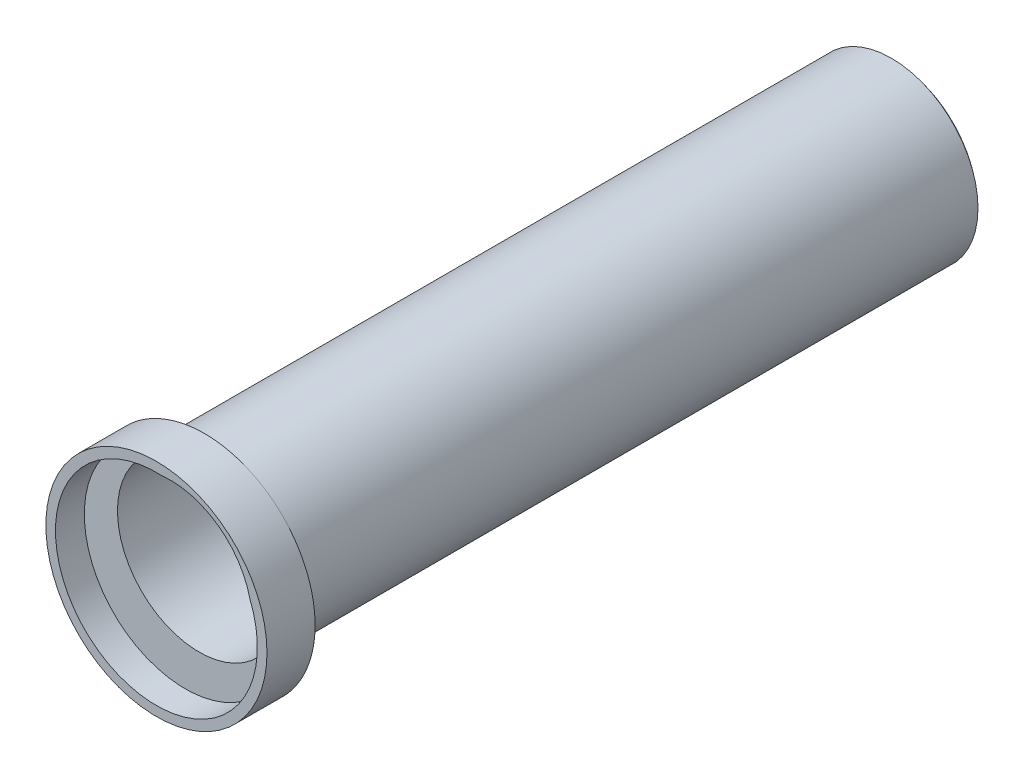
ISO-10303-21;
HEADER;
FILE_DESCRIPTION(('STEP AP214'),'2;1');
FILE_NAME('part.step','',(''),(''),'','','');
FILE_SCHEMA(('AUTOMOTIVE_DESIGN { 1 0 10303 214 1 1 1 1 }'));
ENDSEC;
DATA;
#1=APPLICATION_CONTEXT('core data for automotive mechanical design processes');
#2=APPLICATION_PROTOCOL_DEFINITION('international standard','automotive_design',2000,#1);
#3=PRODUCT_CONTEXT('',#1,'mechanical');
#4=PRODUCT('Part','Part','',(#3));
#5=PRODUCT_RELATED_PRODUCT_CATEGORY('part','',(#4));
#6=PRODUCT_DEFINITION_FORMATION('','',#4);
#7=PRODUCT_DEFINITION_CONTEXT('part definition',#1,'design');
#8=PRODUCT_DEFINITION('design','',#6,#7);
#9=PRODUCT_DEFINITION_SHAPE('','',#8);
#10=(LENGTH_UNIT() NAMED_UNIT(*) SI_UNIT(.MILLI.,.METRE.));
#11=(NAMED_UNIT(*) PLANE_ANGLE_UNIT() SI_UNIT($,.RADIAN.));
#12=(NAMED_UNIT(*) SI_UNIT($,.STERADIAN.) SOLID_ANGLE_UNIT());
#13=UNCERTAINTY_MEASURE_WITH_UNIT(LENGTH_MEASURE(1.E-05),#10,'distance_accuracy_value','');
#14=(GEOMETRIC_REPRESENTATION_CONTEXT(3) GLOBAL_UNCERTAINTY_ASSIGNED_CONTEXT((#13)) GLOBAL_UNIT_ASSIGNED_CONTEXT((#10,
#11,#12)) REPRESENTATION_CONTEXT('',''));
#15=CARTESIAN_POINT('',(0.,0.,0.));
#16=DIRECTION('',(0.,0.,1.));
#17=DIRECTION('',(1.,0.,0.));
#18=AXIS2_PLACEMENT_3D('',#15,#16,#17);
#19=CARTESIAN_POINT('',(0.,0.,4.));
#20=DIRECTION('',(0.,0.,1.));
#21=DIRECTION('',(1.,0.,0.));
#22=AXIS2_PLACEMENT_3D('',#19,#20,#21);
#23=CYLINDRICAL_SURFACE('',#22,21.);
#24=DIRECTION('',(0.,0.,-1.));
#25=VECTOR('',#24,1.);
#26=CARTESIAN_POINT('',(1.07946275047313,20.9722378436432,9.));
#27=LINE('',#26,#25);
#28=CARTESIAN_POINT('',(1.07946275047313,20.9722378436432,10.));
#29=VERTEX_POINT('',#28);
#30=CARTESIAN_POINT('',(1.07946275047313,20.9722378436432,4.));
#31=VERTEX_POINT('',#30);
#32=EDGE_CURVE('E52',#29,#31,#27,.T.);
#33=ORIENTED_EDGE('',*,*,#32,.F.);
#34=CARTESIAN_POINT('',(0.,0.,10.));
#35=DIRECTION('',(0.,0.,1.));
#36=DIRECTION('',(1.,0.,0.));
#37=AXIS2_PLACEMENT_3D('',#34,#35,#36);
#38=CIRCLE('',#37,21.);
#39=CARTESIAN_POINT('',(19.4702575687273,7.86823170778642,10.));
#40=VERTEX_POINT('',#39);
#41=EDGE_CURVE('E69',#29,#40,#38,.T.);
#42=ORIENTED_EDGE('',*,*,#41,.T.);
#43=DIRECTION('',(0.,0.,-1.));
#44=VECTOR('',#43,1.);
#45=CARTESIAN_POINT('',(19.4702575687273,7.86823170778642,9.));
#46=LINE('',#45,#44);
#47=CARTESIAN_POINT('',(19.4702575687273,7.86823170778642,4.));
#48=VERTEX_POINT('',#47);
#49=EDGE_CURVE('E65',#48,#40,#46,.F.);
#50=ORIENTED_EDGE('',*,*,#49,.F.);
#51=CARTESIAN_POINT('',(0.,0.,4.));
#52=DIRECTION('',(0.,0.,1.));
#53=DIRECTION('',(1.,0.,0.));
#54=AXIS2_PLACEMENT_3D('',#51,#52,#53);
#55=CIRCLE('',#54,21.);
#56=EDGE_CURVE('E67',#31,#48,#55,.T.);
#57=ORIENTED_EDGE('',*,*,#56,.F.);
#58=EDGE_LOOP('',(#33,#42,#50,#57));
#59=FACE_BOUND('',#58,.T.);
#60=ADVANCED_FACE('F36',(#59),#23,.F.);
#61=CARTESIAN_POINT('',(0.,0.,10.));
#62=DIRECTION('',(0.,0.,-1.));
#63=DIRECTION('',(-1.,0.,0.));
#64=AXIS2_PLACEMENT_3D('',#61,#62,#63);
#65=CYLINDRICAL_SURFACE('',#64,23.);
#66=CARTESIAN_POINT('',(0.,0.,10.));
#67=DIRECTION('',(0.,0.,1.));
#68=DIRECTION('',(1.,0.,0.));
#69=AXIS2_PLACEMENT_3D('',#66,#67,#68);
#70=CIRCLE('',#69,23.);
#71=CARTESIAN_POINT('',(23.,0.,10.));
#72=VERTEX_POINT('',#71);
#73=EDGE_CURVE('E84',#72,#72,#70,.T.);
#74=ORIENTED_EDGE('',*,*,#73,.F.);
#75=EDGE_LOOP('',(#74));
#76=FACE_BOUND('',#75,.T.);
#77=CARTESIAN_POINT('',(0.,0.,0.));
#78=DIRECTION('',(0.,0.,1.));
#79=DIRECTION('',(1.,0.,0.));
#80=AXIS2_PLACEMENT_3D('',#77,#78,#79);
#81=CIRCLE('',#80,23.);
#82=CARTESIAN_POINT('',(23.,0.,0.));
#83=VERTEX_POINT('',#82);
#84=EDGE_CURVE('E40',#83,#83,#81,.T.);
#85=ORIENTED_EDGE('',*,*,#84,.T.);
#86=EDGE_LOOP('',(#85));
#87=FACE_BOUND('',#86,.T.);
#88=ADVANCED_FACE('F38',(#76,#87),#65,.T.);
#89=CARTESIAN_POINT('',(0.,0.,10.));
#90=DIRECTION('',(0.,0.,1.));
#91=DIRECTION('',(1.,0.,0.));
#92=AXIS2_PLACEMENT_3D('',#89,#90,#91);
#93=PLANE('',#92);
#94=ORIENTED_EDGE('',*,*,#41,.F.);
#95=CARTESIAN_POINT('',(2.9,4.07,10.));
#96=DIRECTION('',(0.,0.,1.));
#97=DIRECTION('',(1.,0.,0.));
#98=AXIS2_PLACEMENT_3D('',#95,#96,#97);
#99=CIRCLE('',#98,17.);
#100=EDGE_CURVE('E57',#29,#40,#99,.F.);
#101=ORIENTED_EDGE('',*,*,#100,.T.);
#102=EDGE_LOOP('',(#94,#101));
#103=FACE_BOUND('',#102,.T.);
#104=ORIENTED_EDGE('',*,*,#73,.T.);
#105=EDGE_LOOP('',(#104));
#106=FACE_BOUND('',#105,.T.);
#107=ADVANCED_FACE('F95',(#103,#106),#93,.T.);
#108=CARTESIAN_POINT('',(0.,0.,0.));
#109=DIRECTION('',(0.,0.,1.));
#110=DIRECTION('',(1.,0.,0.));
#111=AXIS2_PLACEMENT_3D('',#108,#109,#110);
#112=PLANE('',#111);
#113=CARTESIAN_POINT('',(2.9,4.07,0.));
#114=DIRECTION('',(0.,0.,-1.));
#115=DIRECTION('',(-1.,0.,0.));
#116=AXIS2_PLACEMENT_3D('',#113,#114,#115);
#117=CIRCLE('',#116,18.);
#118=CARTESIAN_POINT('',(-15.1,4.07,0.));
#119=VERTEX_POINT('',#118);
#120=EDGE_CURVE('E45',#119,#119,#117,.T.);
#121=ORIENTED_EDGE('',*,*,#120,.F.);
#122=EDGE_LOOP('',(#121));
#123=FACE_BOUND('',#122,.T.);
#124=ORIENTED_EDGE('',*,*,#84,.F.);
#125=EDGE_LOOP('',(#124));
#126=FACE_BOUND('',#125,.T.);
#127=ADVANCED_FACE('F92',(#123,#126),#112,.F.);
#128=CARTESIAN_POINT('',(2.9,4.07,-140.));
#129=DIRECTION('',(0.,0.,1.));
#130=DIRECTION('',(1.,0.,0.));
#131=AXIS2_PLACEMENT_3D('',#128,#129,#130);
#132=CYLINDRICAL_SURFACE('',#131,18.);
#133=CARTESIAN_POINT('',(2.9,4.07,-140.));
#134=DIRECTION('',(0.,0.,-1.));
#135=DIRECTION('',(-1.,0.,0.));
#136=AXIS2_PLACEMENT_3D('',#133,#134,#135);
#137=CIRCLE('',#136,18.);
#138=CARTESIAN_POINT('',(-15.1,4.07,-140.));
#139=VERTEX_POINT('',#138);
#140=EDGE_CURVE('E75',#139,#139,#137,.T.);
#141=ORIENTED_EDGE('',*,*,#140,.F.);
#142=EDGE_LOOP('',(#141));
#143=FACE_BOUND('',#142,.T.);
#144=ORIENTED_EDGE('',*,*,#120,.T.);
#145=EDGE_LOOP('',(#144));
#146=FACE_BOUND('',#145,.T.);
#147=ADVANCED_FACE('F94',(#143,#146),#132,.T.);
#148=CARTESIAN_POINT('',(0.,0.,4.));
#149=DIRECTION('',(0.,0.,1.));
#150=DIRECTION('',(1.,0.,0.));
#151=AXIS2_PLACEMENT_3D('',#148,#149,#150);
#152=PLANE('',#151);
#153=CARTESIAN_POINT('',(2.9,4.07,4.));
#154=DIRECTION('',(0.,0.,1.));
#155=DIRECTION('',(1.,0.,0.));
#156=AXIS2_PLACEMENT_3D('',#153,#154,#155);
#157=CIRCLE('',#156,17.);
#158=EDGE_CURVE('E11',#31,#48,#157,.T.);
#159=ORIENTED_EDGE('',*,*,#158,.F.);
#160=ORIENTED_EDGE('',*,*,#56,.T.);
#161=EDGE_LOOP('',(#159,#160));
#162=FACE_BOUND('',#161,.T.);
#163=ADVANCED_FACE('F74',(#162),#152,.T.);
#164=CARTESIAN_POINT('',(2.9,4.07,-139.));
#165=DIRECTION('',(0.,0.,1.));
#166=DIRECTION('',(1.,0.,0.));
#167=AXIS2_PLACEMENT_3D('',#164,#165,#166);
#168=CYLINDRICAL_SURFACE('',#167,17.);
#169=CARTESIAN_POINT('',(2.9,4.07,-139.));
#170=DIRECTION('',(0.,0.,1.));
#171=DIRECTION('',(1.,0.,0.));
#172=AXIS2_PLACEMENT_3D('',#169,#170,#171);
#173=CIRCLE('',#172,17.);
#174=CARTESIAN_POINT('',(19.9,4.07,-139.));
#175=VERTEX_POINT('',#174);
#176=EDGE_CURVE('E79',#175,#175,#173,.T.);
#177=ORIENTED_EDGE('',*,*,#176,.F.);
#178=EDGE_LOOP('',(#177));
#179=FACE_BOUND('',#178,.T.);
#180=ORIENTED_EDGE('',*,*,#158,.T.);
#181=ORIENTED_EDGE('',*,*,#49,.T.);
#182=ORIENTED_EDGE('',*,*,#100,.F.);
#183=ORIENTED_EDGE('',*,*,#32,.T.);
#184=EDGE_LOOP('',(#180,#181,#182,#183));
#185=FACE_BOUND('',#184,.T.);
#186=ADVANCED_FACE('F72',(#179,#185),#168,.F.);
#187=CARTESIAN_POINT('',(2.9,4.07,-139.));
#188=DIRECTION('',(0.,0.,1.));
#189=DIRECTION('',(1.,0.,0.));
#190=AXIS2_PLACEMENT_3D('',#187,#188,#189);
#191=PLANE('',#190);
#192=ORIENTED_EDGE('',*,*,#176,.T.);
#193=EDGE_LOOP('',(#192));
#194=FACE_BOUND('',#193,.T.);
#195=ADVANCED_FACE('F117',(#194),#191,.T.);
#196=CARTESIAN_POINT('',(2.9,4.07,-142.921547380535));
#197=DIRECTION('',(0.,0.,-1.));
#198=DIRECTION('',(-1.,0.,0.));
#199=AXIS2_PLACEMENT_3D('',#196,#197,#198);
#200=PLANE('',#199);
#201=CARTESIAN_POINT('',(2.9,4.07,-142.921547380535));
#202=DIRECTION('',(0.,0.,-1.));
#203=DIRECTION('',(-1.,0.,0.));
#204=AXIS2_PLACEMENT_3D('',#201,#202,#203);
#205=CIRCLE('',#204,10.);
#206=CARTESIAN_POINT('',(-7.1,4.07,-142.921547380535));
#207=VERTEX_POINT('',#206);
#208=EDGE_CURVE('E70',#207,#207,#205,.T.);
#209=ORIENTED_EDGE('',*,*,#208,.T.);
#210=EDGE_LOOP('',(#209));
#211=FACE_BOUND('',#210,.T.);
#212=ADVANCED_FACE('F121',(#211),#200,.T.);
#213=CARTESIAN_POINT('',(2.9,4.07,-130.97497196684));
#214=DIRECTION('',(0.,0.,-1.));
#215=DIRECTION('',(-1.,0.,0.));
#216=AXIS2_PLACEMENT_3D('',#213,#214,#215);
#217=DEGENERATE_TOROIDAL_SURFACE('',#216,10.170654180263,11.9477942300813,.T.);
#218=ORIENTED_EDGE('',*,*,#140,.T.);
#219=EDGE_LOOP('',(#218));
#220=FACE_BOUND('',#219,.T.);
#221=ORIENTED_EDGE('',*,*,#208,.F.);
#222=EDGE_LOOP('',(#221));
#223=FACE_BOUND('',#222,.T.);
#224=ADVANCED_FACE('F125',(#220,#223),#217,.T.);
#225=CLOSED_SHELL('',(#60,#88,#107,#127,#147,#163,#186,#195,#212,#224));
#226=MANIFOLD_SOLID_BREP('B2',#225);
#227=ADVANCED_BREP_SHAPE_REPRESENTATION('',(#18,#226),#14);
#228=SHAPE_DEFINITION_REPRESENTATION(#9,#227);
ENDSEC;
END-ISO-10303-21;
